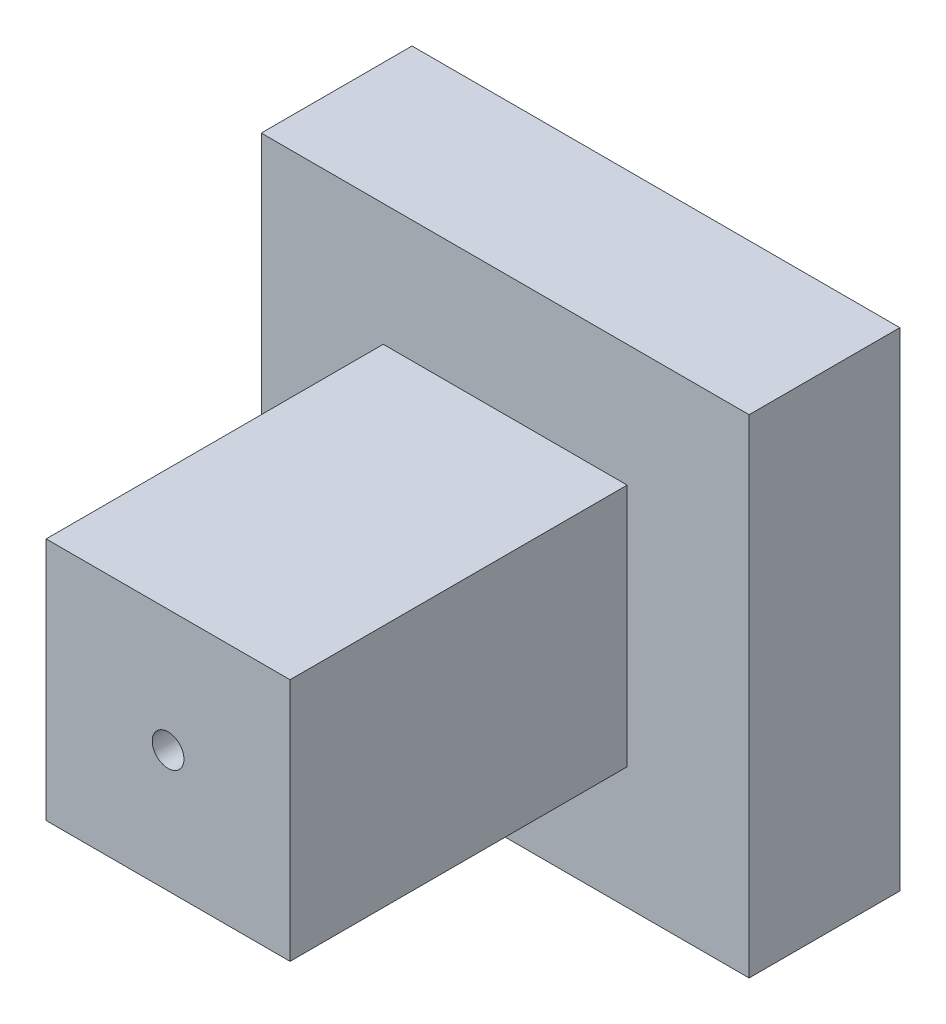
ISO-10303-21;
HEADER;
FILE_DESCRIPTION(('STEP AP214'),'2;1');
FILE_NAME('part.step','',(''),(''),'','','');
FILE_SCHEMA(('AUTOMOTIVE_DESIGN { 1 0 10303 214 1 1 1 1 }'));
ENDSEC;
DATA;
#1=APPLICATION_CONTEXT('core data for automotive mechanical design processes');
#2=APPLICATION_PROTOCOL_DEFINITION('international standard','automotive_design',2000,#1);
#3=PRODUCT_CONTEXT('',#1,'mechanical');
#4=PRODUCT('Part','Part','',(#3));
#5=PRODUCT_RELATED_PRODUCT_CATEGORY('part','',(#4));
#6=PRODUCT_DEFINITION_FORMATION('','',#4);
#7=PRODUCT_DEFINITION_CONTEXT('part definition',#1,'design');
#8=PRODUCT_DEFINITION('design','',#6,#7);
#9=PRODUCT_DEFINITION_SHAPE('','',#8);
#10=(LENGTH_UNIT() NAMED_UNIT(*) SI_UNIT(.MILLI.,.METRE.));
#11=(NAMED_UNIT(*) PLANE_ANGLE_UNIT() SI_UNIT($,.RADIAN.));
#12=(NAMED_UNIT(*) SI_UNIT($,.STERADIAN.) SOLID_ANGLE_UNIT());
#13=UNCERTAINTY_MEASURE_WITH_UNIT(LENGTH_MEASURE(1.E-05),#10,'distance_accuracy_value','');
#14=(GEOMETRIC_REPRESENTATION_CONTEXT(3) GLOBAL_UNCERTAINTY_ASSIGNED_CONTEXT((#13)) GLOBAL_UNIT_ASSIGNED_CONTEXT((#10,
#11,#12)) REPRESENTATION_CONTEXT('',''));
#15=CARTESIAN_POINT('',(0.,0.,0.));
#16=DIRECTION('',(0.,0.,1.));
#17=DIRECTION('',(1.,0.,0.));
#18=AXIS2_PLACEMENT_3D('',#15,#16,#17);
#19=CARTESIAN_POINT('',(-52.3765310087068,38.1979707575598,138.2));
#20=DIRECTION('',(0.,1.,0.));
#21=DIRECTION('',(-1.,0.,0.));
#22=AXIS2_PLACEMENT_3D('',#19,#20,#21);
#23=PLANE('',#22);
#24=DIRECTION('',(1.,0.,0.));
#25=VECTOR('',#24,1.);
#26=CARTESIAN_POINT('',(-52.3765310087068,38.1979707575598,0.));
#27=LINE('',#26,#25);
#28=CARTESIAN_POINT('',(-52.3765310087068,38.1979707575598,0.));
#29=VERTEX_POINT('',#28);
#30=CARTESIAN_POINT('',(47.6234689912931,38.1979707575598,0.));
#31=VERTEX_POINT('',#30);
#32=EDGE_CURVE('E150',#29,#31,#27,.T.);
#33=ORIENTED_EDGE('',*,*,#32,.F.);
#34=DIRECTION('',(0.,0.,-1.));
#35=VECTOR('',#34,1.);
#36=CARTESIAN_POINT('',(-52.3765310087068,38.1979707575598,138.2));
#37=LINE('',#36,#35);
#38=CARTESIAN_POINT('',(-52.3765310087068,38.1979707575598,138.2));
#39=VERTEX_POINT('',#38);
#40=EDGE_CURVE('E11',#39,#29,#37,.T.);
#41=ORIENTED_EDGE('',*,*,#40,.F.);
#42=DIRECTION('',(1.,0.,0.));
#43=VECTOR('',#42,1.);
#44=CARTESIAN_POINT('',(-52.3765310087068,38.1979707575598,138.2));
#45=LINE('',#44,#43);
#46=CARTESIAN_POINT('',(47.6234689912931,38.1979707575598,138.2));
#47=VERTEX_POINT('',#46);
#48=EDGE_CURVE('E157',#39,#47,#45,.T.);
#49=ORIENTED_EDGE('',*,*,#48,.T.);
#50=DIRECTION('',(0.,0.,-1.));
#51=VECTOR('',#50,1.);
#52=CARTESIAN_POINT('',(47.6234689912931,38.1979707575598,138.2));
#53=LINE('',#52,#51);
#54=EDGE_CURVE('E171',#47,#31,#53,.T.);
#55=ORIENTED_EDGE('',*,*,#54,.T.);
#56=EDGE_LOOP('',(#33,#41,#49,#55));
#57=FACE_BOUND('',#56,.T.);
#58=ADVANCED_FACE('F39',(#57),#23,.T.);
#59=CARTESIAN_POINT('',(-52.3765310087068,38.1979707575598,138.2));
#60=DIRECTION('',(1.,0.,0.));
#61=DIRECTION('',(0.,1.,0.));
#62=AXIS2_PLACEMENT_3D('',#59,#60,#61);
#63=PLANE('',#62);
#64=DIRECTION('',(0.,-1.,0.));
#65=VECTOR('',#64,1.);
#66=CARTESIAN_POINT('',(-52.3765310087068,38.1979707575598,0.));
#67=LINE('',#66,#65);
#68=CARTESIAN_POINT('',(-52.3765310087068,-61.8020292424403,0.));
#69=VERTEX_POINT('',#68);
#70=EDGE_CURVE('E161',#29,#69,#67,.T.);
#71=ORIENTED_EDGE('',*,*,#70,.T.);
#72=DIRECTION('',(0.,0.,-1.));
#73=VECTOR('',#72,1.);
#74=CARTESIAN_POINT('',(-52.3765310087068,-61.8020292424403,138.2));
#75=LINE('',#74,#73);
#76=CARTESIAN_POINT('',(-52.3765310087068,-61.8020292424403,138.2));
#77=VERTEX_POINT('',#76);
#78=EDGE_CURVE('E49',#77,#69,#75,.T.);
#79=ORIENTED_EDGE('',*,*,#78,.F.);
#80=DIRECTION('',(0.,-1.,0.));
#81=VECTOR('',#80,1.);
#82=CARTESIAN_POINT('',(-52.3765310087068,38.1979707575598,138.2));
#83=LINE('',#82,#81);
#84=EDGE_CURVE('E168',#39,#77,#83,.T.);
#85=ORIENTED_EDGE('',*,*,#84,.F.);
#86=ORIENTED_EDGE('',*,*,#40,.T.);
#87=EDGE_LOOP('',(#71,#79,#85,#86));
#88=FACE_BOUND('',#87,.T.);
#89=ADVANCED_FACE('F204',(#88),#63,.F.);
#90=CARTESIAN_POINT('',(-52.3765310087068,-61.8020292424403,138.2));
#91=DIRECTION('',(0.,1.,0.));
#92=DIRECTION('',(0.,0.,1.));
#93=AXIS2_PLACEMENT_3D('',#90,#91,#92);
#94=PLANE('',#93);
#95=DIRECTION('',(1.,0.,0.));
#96=VECTOR('',#95,1.);
#97=CARTESIAN_POINT('',(-52.3765310087068,-61.8020292424403,0.));
#98=LINE('',#97,#96);
#99=CARTESIAN_POINT('',(47.6234689912931,-61.8020292424403,0.));
#100=VERTEX_POINT('',#99);
#101=EDGE_CURVE('E177',#69,#100,#98,.T.);
#102=ORIENTED_EDGE('',*,*,#101,.T.);
#103=DIRECTION('',(0.,0.,-1.));
#104=VECTOR('',#103,1.);
#105=CARTESIAN_POINT('',(47.6234689912931,-61.8020292424403,138.2));
#106=LINE('',#105,#104);
#107=CARTESIAN_POINT('',(47.6234689912931,-61.8020292424403,138.2));
#108=VERTEX_POINT('',#107);
#109=EDGE_CURVE('E187',#108,#100,#106,.T.);
#110=ORIENTED_EDGE('',*,*,#109,.F.);
#111=DIRECTION('',(1.,0.,0.));
#112=VECTOR('',#111,1.);
#113=CARTESIAN_POINT('',(-52.3765310087068,-61.8020292424403,138.2));
#114=LINE('',#113,#112);
#115=EDGE_CURVE('E165',#77,#108,#114,.T.);
#116=ORIENTED_EDGE('',*,*,#115,.F.);
#117=ORIENTED_EDGE('',*,*,#78,.T.);
#118=EDGE_LOOP('',(#102,#110,#116,#117));
#119=FACE_BOUND('',#118,.T.);
#120=ADVANCED_FACE('F209',(#119),#94,.F.);
#121=CARTESIAN_POINT('',(47.6234689912931,38.1979707575598,138.2));
#122=DIRECTION('',(1.,0.,0.));
#123=DIRECTION('',(0.,0.,-1.));
#124=AXIS2_PLACEMENT_3D('',#121,#122,#123);
#125=PLANE('',#124);
#126=DIRECTION('',(0.,-1.,0.));
#127=VECTOR('',#126,1.);
#128=CARTESIAN_POINT('',(47.6234689912931,38.1979707575598,0.));
#129=LINE('',#128,#127);
#130=EDGE_CURVE('E174',#31,#100,#129,.T.);
#131=ORIENTED_EDGE('',*,*,#130,.F.);
#132=ORIENTED_EDGE('',*,*,#54,.F.);
#133=DIRECTION('',(0.,-1.,0.));
#134=VECTOR('',#133,1.);
#135=CARTESIAN_POINT('',(47.6234689912931,38.1979707575598,138.2));
#136=LINE('',#135,#134);
#137=EDGE_CURVE('E160',#47,#108,#136,.T.);
#138=ORIENTED_EDGE('',*,*,#137,.T.);
#139=ORIENTED_EDGE('',*,*,#109,.T.);
#140=EDGE_LOOP('',(#131,#132,#138,#139));
#141=FACE_BOUND('',#140,.T.);
#142=ADVANCED_FACE('F196',(#141),#125,.T.);
#143=CARTESIAN_POINT('',(0.,0.,138.2));
#144=DIRECTION('',(0.,0.,-1.));
#145=DIRECTION('',(-1.,0.,0.));
#146=AXIS2_PLACEMENT_3D('',#143,#144,#145);
#147=PLANE('',#146);
#148=CARTESIAN_POINT('',(-2.37653100870682,-11.8020292424403,138.2));
#149=DIRECTION('',(0.,0.,-1.));
#150=DIRECTION('',(-1.,0.,0.));
#151=AXIS2_PLACEMENT_3D('',#148,#149,#150);
#152=CIRCLE('',#151,6.5);
#153=CARTESIAN_POINT('',(-8.87653100870682,-11.8020292424403,138.2));
#154=VERTEX_POINT('',#153);
#155=EDGE_CURVE('E42',#154,#154,#152,.F.);
#156=ORIENTED_EDGE('',*,*,#155,.F.);
#157=EDGE_LOOP('',(#156));
#158=FACE_BOUND('',#157,.T.);
#159=ORIENTED_EDGE('',*,*,#48,.F.);
#160=ORIENTED_EDGE('',*,*,#84,.T.);
#161=ORIENTED_EDGE('',*,*,#115,.T.);
#162=ORIENTED_EDGE('',*,*,#137,.F.);
#163=EDGE_LOOP('',(#159,#160,#161,#162));
#164=FACE_BOUND('',#163,.T.);
#165=ADVANCED_FACE('F207',(#158,#164),#147,.F.);
#166=CARTESIAN_POINT('',(97.623468991293,88.1979707575598,-61.8));
#167=DIRECTION('',(0.,1.,0.));
#168=DIRECTION('',(-1.,0.,0.));
#169=AXIS2_PLACEMENT_3D('',#166,#167,#168);
#170=PLANE('',#169);
#171=DIRECTION('',(-1.,0.,0.));
#172=VECTOR('',#171,1.);
#173=CARTESIAN_POINT('',(97.623468991293,88.1979707575598,0.));
#174=LINE('',#173,#172);
#175=CARTESIAN_POINT('',(97.623468991293,88.1979707575598,0.));
#176=VERTEX_POINT('',#175);
#177=CARTESIAN_POINT('',(-102.376531008706,88.1979707575592,0.));
#178=VERTEX_POINT('',#177);
#179=EDGE_CURVE('E140',#176,#178,#174,.T.);
#180=ORIENTED_EDGE('',*,*,#179,.F.);
#181=DIRECTION('',(0.,0.,1.));
#182=VECTOR('',#181,1.);
#183=CARTESIAN_POINT('',(97.623468991293,88.1979707575598,-61.8));
#184=LINE('',#183,#182);
#185=CARTESIAN_POINT('',(97.623468991293,88.1979707575598,-61.8));
#186=VERTEX_POINT('',#185);
#187=EDGE_CURVE('E125',#186,#176,#184,.T.);
#188=ORIENTED_EDGE('',*,*,#187,.F.);
#189=DIRECTION('',(-1.,0.,0.));
#190=VECTOR('',#189,1.);
#191=CARTESIAN_POINT('',(97.623468991293,88.1979707575598,-61.8));
#192=LINE('',#191,#190);
#193=CARTESIAN_POINT('',(-102.376531008706,88.1979707575592,-61.8));
#194=VERTEX_POINT('',#193);
#195=EDGE_CURVE('E118',#186,#194,#192,.T.);
#196=ORIENTED_EDGE('',*,*,#195,.T.);
#197=DIRECTION('',(0.,0.,1.));
#198=VECTOR('',#197,1.);
#199=CARTESIAN_POINT('',(-102.376531008706,88.1979707575592,-61.8));
#200=LINE('',#199,#198);
#201=EDGE_CURVE('E101',#194,#178,#200,.T.);
#202=ORIENTED_EDGE('',*,*,#201,.T.);
#203=EDGE_LOOP('',(#180,#188,#196,#202));
#204=FACE_BOUND('',#203,.T.);
#205=ADVANCED_FACE('F124',(#204),#170,.T.);
#206=CARTESIAN_POINT('',(97.623468991293,88.1979707575598,-61.8));
#207=DIRECTION('',(-1.,0.,0.));
#208=DIRECTION('',(0.,-1.,0.));
#209=AXIS2_PLACEMENT_3D('',#206,#207,#208);
#210=PLANE('',#209);
#211=DIRECTION('',(0.,-1.,0.));
#212=VECTOR('',#211,1.);
#213=CARTESIAN_POINT('',(97.623468991293,88.1979707575598,0.));
#214=LINE('',#213,#212);
#215=CARTESIAN_POINT('',(97.6234689912937,-111.80202924244,0.));
#216=VERTEX_POINT('',#215);
#217=EDGE_CURVE('E128',#176,#216,#214,.T.);
#218=ORIENTED_EDGE('',*,*,#217,.T.);
#219=DIRECTION('',(0.,0.,1.));
#220=VECTOR('',#219,1.);
#221=CARTESIAN_POINT('',(97.6234689912937,-111.80202924244,-61.8));
#222=LINE('',#221,#220);
#223=CARTESIAN_POINT('',(97.6234689912937,-111.80202924244,-61.8));
#224=VERTEX_POINT('',#223);
#225=EDGE_CURVE('E151',#224,#216,#222,.T.);
#226=ORIENTED_EDGE('',*,*,#225,.F.);
#227=DIRECTION('',(0.,-1.,0.));
#228=VECTOR('',#227,1.);
#229=CARTESIAN_POINT('',(97.623468991293,88.1979707575598,-61.8));
#230=LINE('',#229,#228);
#231=EDGE_CURVE('E113',#186,#224,#230,.T.);
#232=ORIENTED_EDGE('',*,*,#231,.F.);
#233=ORIENTED_EDGE('',*,*,#187,.T.);
#234=EDGE_LOOP('',(#218,#226,#232,#233));
#235=FACE_BOUND('',#234,.T.);
#236=ADVANCED_FACE('F245',(#235),#210,.F.);
#237=CARTESIAN_POINT('',(97.6234689912937,-111.80202924244,-61.8));
#238=DIRECTION('',(0.,1.,0.));
#239=DIRECTION('',(0.,0.,1.));
#240=AXIS2_PLACEMENT_3D('',#237,#238,#239);
#241=PLANE('',#240);
#242=DIRECTION('',(-1.,0.,0.));
#243=VECTOR('',#242,1.);
#244=CARTESIAN_POINT('',(97.6234689912937,-111.80202924244,0.));
#245=LINE('',#244,#243);
#246=CARTESIAN_POINT('',(-102.376531008706,-111.80202924244,0.));
#247=VERTEX_POINT('',#246);
#248=EDGE_CURVE('E131',#216,#247,#245,.T.);
#249=ORIENTED_EDGE('',*,*,#248,.T.);
#250=DIRECTION('',(0.,0.,1.));
#251=VECTOR('',#250,1.);
#252=CARTESIAN_POINT('',(-102.376531008706,-111.80202924244,-61.8));
#253=LINE('',#252,#251);
#254=CARTESIAN_POINT('',(-102.376531008706,-111.80202924244,-61.8));
#255=VERTEX_POINT('',#254);
#256=EDGE_CURVE('E112',#255,#247,#253,.T.);
#257=ORIENTED_EDGE('',*,*,#256,.F.);
#258=DIRECTION('',(-1.,0.,0.));
#259=VECTOR('',#258,1.);
#260=CARTESIAN_POINT('',(97.6234689912937,-111.80202924244,-61.8));
#261=LINE('',#260,#259);
#262=EDGE_CURVE('E120',#224,#255,#261,.T.);
#263=ORIENTED_EDGE('',*,*,#262,.F.);
#264=ORIENTED_EDGE('',*,*,#225,.T.);
#265=EDGE_LOOP('',(#249,#257,#263,#264));
#266=FACE_BOUND('',#265,.T.);
#267=ADVANCED_FACE('F254',(#266),#241,.F.);
#268=CARTESIAN_POINT('',(-102.376531008706,88.1979707575592,-61.8));
#269=DIRECTION('',(-1.,0.,0.));
#270=DIRECTION('',(0.,-1.,0.));
#271=AXIS2_PLACEMENT_3D('',#268,#269,#270);
#272=PLANE('',#271);
#273=DIRECTION('',(0.,-1.,0.));
#274=VECTOR('',#273,1.);
#275=CARTESIAN_POINT('',(-102.376531008706,88.1979707575592,0.));
#276=LINE('',#275,#274);
#277=EDGE_CURVE('E106',#178,#247,#276,.T.);
#278=ORIENTED_EDGE('',*,*,#277,.F.);
#279=ORIENTED_EDGE('',*,*,#201,.F.);
#280=DIRECTION('',(0.,-1.,0.));
#281=VECTOR('',#280,1.);
#282=CARTESIAN_POINT('',(-102.376531008706,88.1979707575592,-61.8));
#283=LINE('',#282,#281);
#284=EDGE_CURVE('E104',#194,#255,#283,.T.);
#285=ORIENTED_EDGE('',*,*,#284,.T.);
#286=ORIENTED_EDGE('',*,*,#256,.T.);
#287=EDGE_LOOP('',(#278,#279,#285,#286));
#288=FACE_BOUND('',#287,.T.);
#289=ADVANCED_FACE('F103',(#288),#272,.T.);
#290=CARTESIAN_POINT('',(0.,0.,-61.8));
#291=DIRECTION('',(0.,0.,1.));
#292=DIRECTION('',(1.,0.,0.));
#293=AXIS2_PLACEMENT_3D('',#290,#291,#292);
#294=PLANE('',#293);
#295=ORIENTED_EDGE('',*,*,#195,.F.);
#296=ORIENTED_EDGE('',*,*,#231,.T.);
#297=ORIENTED_EDGE('',*,*,#262,.T.);
#298=ORIENTED_EDGE('',*,*,#284,.F.);
#299=EDGE_LOOP('',(#295,#296,#297,#298));
#300=FACE_BOUND('',#299,.T.);
#301=ADVANCED_FACE('F117',(#300),#294,.F.);
#302=CARTESIAN_POINT('',(0.,0.,0.));
#303=DIRECTION('',(0.,0.,1.));
#304=DIRECTION('',(1.,0.,0.));
#305=AXIS2_PLACEMENT_3D('',#302,#303,#304);
#306=PLANE('',#305);
#307=ORIENTED_EDGE('',*,*,#70,.F.);
#308=ORIENTED_EDGE('',*,*,#32,.T.);
#309=ORIENTED_EDGE('',*,*,#130,.T.);
#310=ORIENTED_EDGE('',*,*,#101,.F.);
#311=EDGE_LOOP('',(#307,#308,#309,#310));
#312=FACE_BOUND('',#311,.T.);
#313=ORIENTED_EDGE('',*,*,#179,.T.);
#314=ORIENTED_EDGE('',*,*,#277,.T.);
#315=ORIENTED_EDGE('',*,*,#248,.F.);
#316=ORIENTED_EDGE('',*,*,#217,.F.);
#317=EDGE_LOOP('',(#313,#314,#315,#316));
#318=FACE_BOUND('',#317,.T.);
#319=ADVANCED_FACE('F200',(#312,#318),#306,.T.);
#320=CARTESIAN_POINT('',(-2.37653100870682,-11.8020292424403,177.8));
#321=DIRECTION('',(0.,0.,-1.));
#322=DIRECTION('',(-1.,0.,0.));
#323=AXIS2_PLACEMENT_3D('',#320,#321,#322);
#324=CYLINDRICAL_SURFACE('',#323,6.5);
#325=CARTESIAN_POINT('',(-2.37653100870682,-11.8020292424403,0.));
#326=DIRECTION('',(0.,0.,1.));
#327=DIRECTION('',(1.,0.,0.));
#328=AXIS2_PLACEMENT_3D('',#325,#326,#327);
#329=CIRCLE('',#328,6.5);
#330=CARTESIAN_POINT('',(-8.87653100870682,-11.8020292424403,0.));
#331=VERTEX_POINT('',#330);
#332=EDGE_CURVE('E134',#331,#331,#329,.T.);
#333=CARTESIAN_POINT('',(-8.87653100870682,-11.8020292424403,0.));
#334=CARTESIAN_POINT('',(-8.87653100870682,-11.8020292424403,1.43958333333334));
#335=CARTESIAN_POINT('',(-8.87653100870682,-11.8020292424403,2.87916666666667));
#336=CARTESIAN_POINT('',(-8.87653100870682,-11.8020292424403,5.75833333333334));
#337=CARTESIAN_POINT('',(-8.87653100870682,-11.8020292424403,7.19791666666667));
#338=CARTESIAN_POINT('',(-8.87653100870682,-11.8020292424403,10.0770833333333));
#339=CARTESIAN_POINT('',(-8.87653100870682,-11.8020292424403,11.5166666666667));
#340=CARTESIAN_POINT('',(-8.87653100870682,-11.8020292424403,14.3958333333333));
#341=CARTESIAN_POINT('',(-8.87653100870682,-11.8020292424403,15.8354166666667));
#342=CARTESIAN_POINT('',(-8.87653100870682,-11.8020292424403,18.7145833333334));
#343=CARTESIAN_POINT('',(-8.87653100870682,-11.8020292424403,20.1541666666667));
#344=CARTESIAN_POINT('',(-8.87653100870682,-11.8020292424403,23.0333333333333));
#345=CARTESIAN_POINT('',(-8.87653100870682,-11.8020292424403,24.4729166666667));
#346=CARTESIAN_POINT('',(-8.87653100870682,-11.8020292424403,27.3520833333333));
#347=CARTESIAN_POINT('',(-8.87653100870682,-11.8020292424403,28.7916666666667));
#348=CARTESIAN_POINT('',(-8.87653100870682,-11.8020292424403,31.6708333333333));
#349=CARTESIAN_POINT('',(-8.87653100870682,-11.8020292424403,33.1104166666667));
#350=CARTESIAN_POINT('',(-8.87653100870682,-11.8020292424403,35.9895833333333));
#351=CARTESIAN_POINT('',(-8.87653100870682,-11.8020292424403,37.4291666666667));
#352=CARTESIAN_POINT('',(-8.87653100870682,-11.8020292424403,40.3083333333333));
#353=CARTESIAN_POINT('',(-8.87653100870682,-11.8020292424403,41.7479166666667));
#354=CARTESIAN_POINT('',(-8.87653100870682,-11.8020292424403,44.6270833333334));
#355=CARTESIAN_POINT('',(-8.87653100870682,-11.8020292424403,46.0666666666667));
#356=CARTESIAN_POINT('',(-8.87653100870682,-11.8020292424403,48.9458333333334));
#357=CARTESIAN_POINT('',(-8.87653100870682,-11.8020292424403,50.3854166666667));
#358=CARTESIAN_POINT('',(-8.87653100870682,-11.8020292424403,53.2645833333333));
#359=CARTESIAN_POINT('',(-8.87653100870682,-11.8020292424403,54.7041666666667));
#360=CARTESIAN_POINT('',(-8.87653100870682,-11.8020292424403,57.5833333333333));
#361=CARTESIAN_POINT('',(-8.87653100870682,-11.8020292424403,59.0229166666667));
#362=CARTESIAN_POINT('',(-8.87653100870682,-11.8020292424403,61.9020833333333));
#363=CARTESIAN_POINT('',(-8.87653100870682,-11.8020292424403,63.3416666666667));
#364=CARTESIAN_POINT('',(-8.87653100870682,-11.8020292424403,66.2208333333333));
#365=CARTESIAN_POINT('',(-8.87653100870682,-11.8020292424403,67.6604166666667));
#366=CARTESIAN_POINT('',(-8.87653100870682,-11.8020292424403,70.5395833333333));
#367=CARTESIAN_POINT('',(-8.87653100870682,-11.8020292424403,71.9791666666667));
#368=CARTESIAN_POINT('',(-8.87653100870682,-11.8020292424403,74.8583333333333));
#369=CARTESIAN_POINT('',(-8.87653100870682,-11.8020292424403,76.2979166666667));
#370=CARTESIAN_POINT('',(-8.87653100870682,-11.8020292424403,79.1770833333333));
#371=CARTESIAN_POINT('',(-8.87653100870682,-11.8020292424403,80.6166666666667));
#372=CARTESIAN_POINT('',(-8.87653100870682,-11.8020292424403,83.4958333333334));
#373=CARTESIAN_POINT('',(-8.87653100870682,-11.8020292424403,84.9354166666667));
#374=CARTESIAN_POINT('',(-8.87653100870682,-11.8020292424403,87.8145833333333));
#375=CARTESIAN_POINT('',(-8.87653100870682,-11.8020292424403,89.2541666666667));
#376=CARTESIAN_POINT('',(-8.87653100870682,-11.8020292424403,92.1333333333333));
#377=CARTESIAN_POINT('',(-8.87653100870682,-11.8020292424403,93.5729166666667));
#378=CARTESIAN_POINT('',(-8.87653100870682,-11.8020292424403,96.4520833333333));
#379=CARTESIAN_POINT('',(-8.87653100870682,-11.8020292424403,97.8916666666667));
#380=CARTESIAN_POINT('',(-8.87653100870682,-11.8020292424403,100.770833333333));
#381=CARTESIAN_POINT('',(-8.87653100870682,-11.8020292424403,102.210416666667));
#382=CARTESIAN_POINT('',(-8.87653100870682,-11.8020292424403,105.089583333333));
#383=CARTESIAN_POINT('',(-8.87653100870682,-11.8020292424403,106.529166666667));
#384=CARTESIAN_POINT('',(-8.87653100870682,-11.8020292424403,109.408333333333));
#385=CARTESIAN_POINT('',(-8.87653100870682,-11.8020292424403,110.847916666667));
#386=CARTESIAN_POINT('',(-8.87653100870682,-11.8020292424403,113.727083333333));
#387=CARTESIAN_POINT('',(-8.87653100870682,-11.8020292424403,115.166666666667));
#388=CARTESIAN_POINT('',(-8.87653100870682,-11.8020292424403,118.045833333333));
#389=CARTESIAN_POINT('',(-8.87653100870682,-11.8020292424403,119.485416666667));
#390=CARTESIAN_POINT('',(-8.87653100870682,-11.8020292424403,122.364583333333));
#391=CARTESIAN_POINT('',(-8.87653100870682,-11.8020292424403,123.804166666667));
#392=CARTESIAN_POINT('',(-8.87653100870682,-11.8020292424403,126.683333333333));
#393=CARTESIAN_POINT('',(-8.87653100870682,-11.8020292424403,128.122916666667));
#394=CARTESIAN_POINT('',(-8.87653100870682,-11.8020292424403,131.002083333333));
#395=CARTESIAN_POINT('',(-8.87653100870682,-11.8020292424403,132.441666666667));
#396=CARTESIAN_POINT('',(-8.87653100870682,-11.8020292424403,135.320833333333));
#397=CARTESIAN_POINT('',(-8.87653100870682,-11.8020292424403,136.760416666667));
#398=CARTESIAN_POINT('',(-8.87653100870682,-11.8020292424403,138.2));
#399=B_SPLINE_CURVE_WITH_KNOTS('',3,(#333,#334,#335,#336,#337,#338,#339,#340,#341,#342,#343,
#344,#345,#346,#347,#348,#349,#350,#351,#352,#353,#354,#355,#356,#357,#358,#359,#360,#361,#362,
#363,#364,#365,#366,#367,#368,#369,#370,#371,#372,#373,#374,#375,#376,#377,#378,#379,#380,#381,
#382,#383,#384,#385,#386,#387,#388,#389,#390,#391,#392,#393,#394,#395,#396,#397,#398),
.UNSPECIFIED.,.F.,.F.,(4,2,2,2,2,2,2,2,2,2,2,2,2,2,2,2,2,2,2,2,2,2,2,2,2,2,2,2,2,2,2,2,4),(0.,
4.31875000000001,8.63749999999999,12.95625,17.275,21.59375,25.9125,30.23125,34.55,38.86875,
43.1875,47.50625,51.825,56.14375,60.4625,64.78125,69.1,73.41875,77.7375,82.05625,86.375,
90.69375,95.0125,99.33125,103.65,107.96875,112.2875,116.60625,120.925,125.24375,129.5625,
133.88125,138.2),.UNSPECIFIED.);
#400=EDGE_CURVE('BSEAM289',#331,#154,#399,.T.);
#401=ORIENTED_EDGE('',*,*,#332,.F.);
#402=ORIENTED_EDGE('',*,*,#155,.T.);
#403=ORIENTED_EDGE('',*,*,#400,.T.);
#404=ORIENTED_EDGE('',*,*,#400,.F.);
#405=EDGE_LOOP('',(#401,#403,#402,#404));
#406=FACE_BOUND('',#405,.T.);
#407=ADVANCED_FACE('F289',(#406),#324,.F.);
#408=CARTESIAN_POINT('',(-2.37653100870682,-11.8020292424403,0.));
#409=DIRECTION('',(0.,0.,1.));
#410=DIRECTION('',(1.,0.,0.));
#411=AXIS2_PLACEMENT_3D('',#408,#409,#410);
#412=PLANE('',#411);
#413=ORIENTED_EDGE('',*,*,#332,.T.);
#414=EDGE_LOOP('',(#413));
#415=FACE_BOUND('',#414,.T.);
#416=ADVANCED_FACE('F305',(#415),#412,.T.);
#417=CLOSED_SHELL('',(#58,#89,#120,#142,#165,#205,#236,#267,#289,#301,#319,#407,#416));
#418=MANIFOLD_SOLID_BREP('B2',#417);
#419=ADVANCED_BREP_SHAPE_REPRESENTATION('',(#18,#418),#14);
#420=SHAPE_DEFINITION_REPRESENTATION(#9,#419);
ENDSEC;
END-ISO-10303-21;
